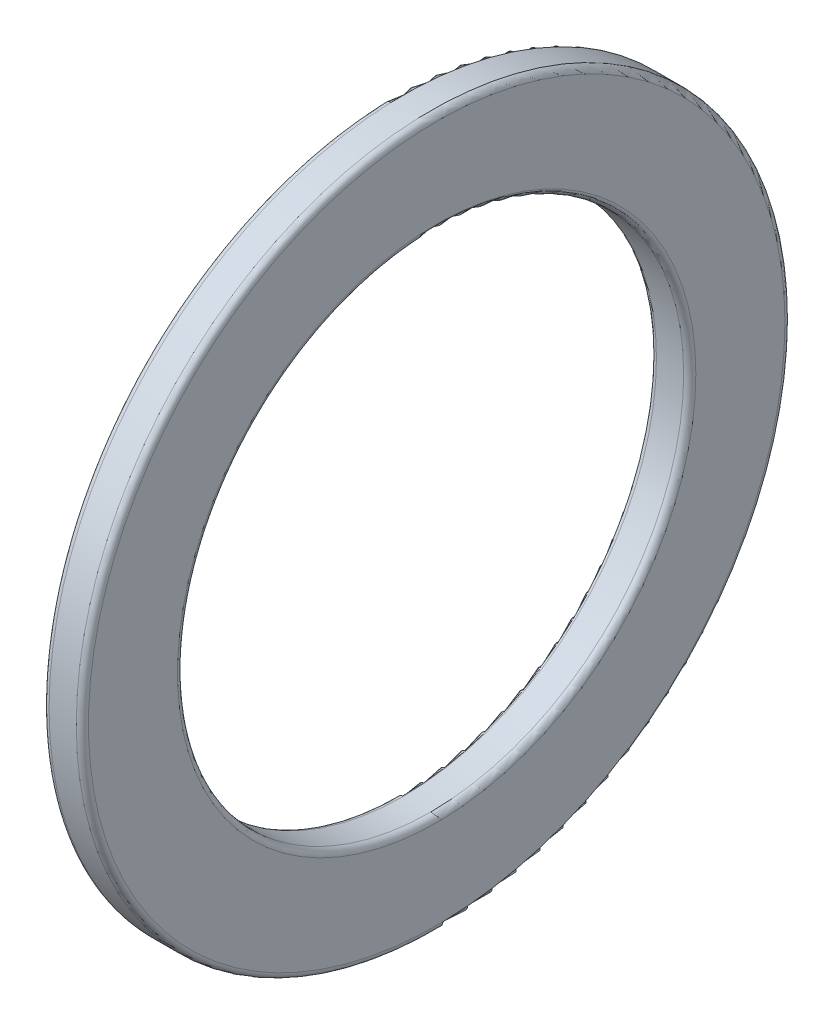
ISO-10303-21;
HEADER;
FILE_DESCRIPTION(('STEP AP214'),'2;1');
FILE_NAME('part.step','',(''),(''),'','','');
FILE_SCHEMA(('AUTOMOTIVE_DESIGN { 1 0 10303 214 1 1 1 1 }'));
ENDSEC;
DATA;
#1=APPLICATION_CONTEXT('core data for automotive mechanical design processes');
#2=APPLICATION_PROTOCOL_DEFINITION('international standard','automotive_design',2000,#1);
#3=PRODUCT_CONTEXT('',#1,'mechanical');
#4=PRODUCT('Part','Part','',(#3));
#5=PRODUCT_RELATED_PRODUCT_CATEGORY('part','',(#4));
#6=PRODUCT_DEFINITION_FORMATION('','',#4);
#7=PRODUCT_DEFINITION_CONTEXT('part definition',#1,'design');
#8=PRODUCT_DEFINITION('design','',#6,#7);
#9=PRODUCT_DEFINITION_SHAPE('','',#8);
#10=(LENGTH_UNIT() NAMED_UNIT(*) SI_UNIT(.MILLI.,.METRE.));
#11=(NAMED_UNIT(*) PLANE_ANGLE_UNIT() SI_UNIT($,.RADIAN.));
#12=(NAMED_UNIT(*) SI_UNIT($,.STERADIAN.) SOLID_ANGLE_UNIT());
#13=UNCERTAINTY_MEASURE_WITH_UNIT(LENGTH_MEASURE(1.E-05),#10,'distance_accuracy_value','');
#14=(GEOMETRIC_REPRESENTATION_CONTEXT(3) GLOBAL_UNCERTAINTY_ASSIGNED_CONTEXT((#13)) GLOBAL_UNIT_ASSIGNED_CONTEXT((#10,
#11,#12)) REPRESENTATION_CONTEXT('',''));
#15=CARTESIAN_POINT('',(0.,0.,0.));
#16=DIRECTION('',(0.,0.,1.));
#17=DIRECTION('',(1.,0.,0.));
#18=AXIS2_PLACEMENT_3D('',#15,#16,#17);
#19=CARTESIAN_POINT('',(0.,34.4,0.));
#20=DIRECTION('',(-1.,0.,0.));
#21=DIRECTION('',(0.,0.,1.));
#22=AXIS2_PLACEMENT_3D('',#19,#20,#21);
#23=PLANE('',#22);
#24=CARTESIAN_POINT('',(0.,0.,0.));
#25=DIRECTION('',(1.,0.,0.));
#26=DIRECTION('',(0.,0.,-1.));
#27=AXIS2_PLACEMENT_3D('',#24,#25,#26);
#28=CIRCLE('',#27,32.103429965518);
#29=CARTESIAN_POINT('',(0.,0.,-32.103429965518));
#30=VERTEX_POINT('',#29);
#31=EDGE_CURVE('E56',#30,#30,#28,.T.);
#32=ORIENTED_EDGE('',*,*,#31,.T.);
#33=EDGE_LOOP('',(#32));
#34=FACE_BOUND('',#33,.T.);
#35=CARTESIAN_POINT('',(0.,0.,0.));
#36=DIRECTION('',(1.,0.,0.));
#37=DIRECTION('',(0.,0.,-1.));
#38=AXIS2_PLACEMENT_3D('',#35,#36,#37);
#39=CIRCLE('',#38,34.4);
#40=CARTESIAN_POINT('',(0.,0.,-34.4));
#41=VERTEX_POINT('',#40);
#42=EDGE_CURVE('E54',#41,#41,#39,.T.);
#43=ORIENTED_EDGE('',*,*,#42,.F.);
#44=EDGE_LOOP('',(#43));
#45=FACE_BOUND('',#44,.T.);
#46=ADVANCED_FACE('F14',(#34,#45),#23,.T.);
#47=CARTESIAN_POINT('',(-3.1111111111112,0.,0.));
#48=DIRECTION('',(1.,0.,0.));
#49=DIRECTION('',(0.,0.,-1.));
#50=AXIS2_PLACEMENT_3D('',#47,#48,#49);
#51=TOROIDAL_SURFACE('',#50,30.5,3.50000000000009);
#52=ORIENTED_EDGE('',*,*,#31,.F.);
#53=EDGE_LOOP('',(#52));
#54=FACE_BOUND('',#53,.T.);
#55=CARTESIAN_POINT('',(0.,0.,0.));
#56=DIRECTION('',(1.,0.,0.));
#57=DIRECTION('',(0.,0.,-1.));
#58=AXIS2_PLACEMENT_3D('',#55,#56,#57);
#59=CIRCLE('',#58,28.896570034482);
#60=CARTESIAN_POINT('',(0.,0.,-28.896570034482));
#61=VERTEX_POINT('',#60);
#62=EDGE_CURVE('E51',#61,#61,#59,.T.);
#63=ORIENTED_EDGE('',*,*,#62,.T.);
#64=EDGE_LOOP('',(#63));
#65=FACE_BOUND('',#64,.T.);
#66=ADVANCED_FACE('F68',(#54,#65),#51,.F.);
#67=CARTESIAN_POINT('',(0.,28.896570034482,0.));
#68=DIRECTION('',(-1.,0.,0.));
#69=DIRECTION('',(0.,0.,1.));
#70=AXIS2_PLACEMENT_3D('',#67,#68,#69);
#71=PLANE('',#70);
#72=CARTESIAN_POINT('',(0.,0.,0.));
#73=DIRECTION('',(1.,0.,0.));
#74=DIRECTION('',(0.,0.,-1.));
#75=AXIS2_PLACEMENT_3D('',#72,#73,#74);
#76=CIRCLE('',#75,25.6);
#77=CARTESIAN_POINT('',(0.,0.,-25.6));
#78=VERTEX_POINT('',#77);
#79=EDGE_CURVE('E50',#78,#78,#76,.T.);
#80=ORIENTED_EDGE('',*,*,#79,.T.);
#81=EDGE_LOOP('',(#80));
#82=FACE_BOUND('',#81,.T.);
#83=ORIENTED_EDGE('',*,*,#62,.F.);
#84=EDGE_LOOP('',(#83));
#85=FACE_BOUND('',#84,.T.);
#86=ADVANCED_FACE('F70',(#82,#85),#71,.T.);
#87=CARTESIAN_POINT('',(0.599999999999872,0.,0.));
#88=DIRECTION('',(1.,0.,0.));
#89=DIRECTION('',(0.,0.,-1.));
#90=AXIS2_PLACEMENT_3D('',#87,#88,#89);
#91=TOROIDAL_SURFACE('',#90,25.6,0.599999999999872);
#92=CARTESIAN_POINT('',(0.6,0.,0.));
#93=DIRECTION('',(1.,0.,0.));
#94=DIRECTION('',(0.,0.,-1.));
#95=AXIS2_PLACEMENT_3D('',#92,#93,#94);
#96=CIRCLE('',#95,25.);
#97=CARTESIAN_POINT('',(0.6,0.,-25.));
#98=VERTEX_POINT('',#97);
#99=EDGE_CURVE('E43',#98,#98,#96,.T.);
#100=ORIENTED_EDGE('',*,*,#99,.T.);
#101=EDGE_LOOP('',(#100));
#102=FACE_BOUND('',#101,.T.);
#103=ORIENTED_EDGE('',*,*,#79,.F.);
#104=EDGE_LOOP('',(#103));
#105=FACE_BOUND('',#104,.T.);
#106=ADVANCED_FACE('F72',(#102,#105),#91,.T.);
#107=CARTESIAN_POINT('',(3.8888888888889,0.,0.));
#108=DIRECTION('',(1.,0.,0.));
#109=DIRECTION('',(0.,0.,-1.));
#110=AXIS2_PLACEMENT_3D('',#107,#108,#109);
#111=CYLINDRICAL_SURFACE('',#110,25.);
#112=CARTESIAN_POINT('',(3.2888888888889,0.,0.));
#113=DIRECTION('',(1.,0.,0.));
#114=DIRECTION('',(0.,0.,-1.));
#115=AXIS2_PLACEMENT_3D('',#112,#113,#114);
#116=CIRCLE('',#115,25.);
#117=CARTESIAN_POINT('',(3.2888888888889,0.,-25.));
#118=VERTEX_POINT('',#117);
#119=EDGE_CURVE('E39',#118,#118,#116,.T.);
#120=ORIENTED_EDGE('',*,*,#119,.T.);
#121=EDGE_LOOP('',(#120));
#122=FACE_BOUND('',#121,.T.);
#123=ORIENTED_EDGE('',*,*,#99,.F.);
#124=EDGE_LOOP('',(#123));
#125=FACE_BOUND('',#124,.T.);
#126=ADVANCED_FACE('F82',(#122,#125),#111,.F.);
#127=CARTESIAN_POINT('',(3.28888888888898,0.,0.));
#128=DIRECTION('',(1.,0.,0.));
#129=DIRECTION('',(0.,0.,-1.));
#130=AXIS2_PLACEMENT_3D('',#127,#128,#129);
#131=TOROIDAL_SURFACE('',#130,25.6,0.59999999999992);
#132=CARTESIAN_POINT('',(3.8888888888889,0.,0.));
#133=DIRECTION('',(1.,0.,0.));
#134=DIRECTION('',(0.,0.,-1.));
#135=AXIS2_PLACEMENT_3D('',#132,#133,#134);
#136=CIRCLE('',#135,25.599999980008);
#137=CARTESIAN_POINT('',(3.8888888888889,0.,-25.599999980008));
#138=VERTEX_POINT('',#137);
#139=EDGE_CURVE('E31',#138,#138,#136,.T.);
#140=ORIENTED_EDGE('',*,*,#139,.T.);
#141=EDGE_LOOP('',(#140));
#142=FACE_BOUND('',#141,.T.);
#143=ORIENTED_EDGE('',*,*,#119,.F.);
#144=EDGE_LOOP('',(#143));
#145=FACE_BOUND('',#144,.T.);
#146=ADVANCED_FACE('F117',(#142,#145),#131,.T.);
#147=CARTESIAN_POINT('',(3.8888888888889,25.6,0.));
#148=DIRECTION('',(1.,0.,0.));
#149=DIRECTION('',(0.,0.,-1.));
#150=AXIS2_PLACEMENT_3D('',#147,#148,#149);
#151=PLANE('',#150);
#152=CARTESIAN_POINT('',(3.8888888888889,0.,0.));
#153=DIRECTION('',(1.,0.,0.));
#154=DIRECTION('',(0.,0.,-1.));
#155=AXIS2_PLACEMENT_3D('',#152,#153,#154);
#156=CIRCLE('',#155,34.4);
#157=CARTESIAN_POINT('',(3.8888888888889,0.,-34.4));
#158=VERTEX_POINT('',#157);
#159=EDGE_CURVE('E29',#158,#158,#156,.T.);
#160=ORIENTED_EDGE('',*,*,#159,.T.);
#161=EDGE_LOOP('',(#160));
#162=FACE_BOUND('',#161,.T.);
#163=ORIENTED_EDGE('',*,*,#139,.F.);
#164=EDGE_LOOP('',(#163));
#165=FACE_BOUND('',#164,.T.);
#166=ADVANCED_FACE('F126',(#162,#165),#151,.T.);
#167=CARTESIAN_POINT('',(3.28888888888895,0.,0.));
#168=DIRECTION('',(1.,0.,0.));
#169=DIRECTION('',(0.,0.,-1.));
#170=AXIS2_PLACEMENT_3D('',#167,#168,#169);
#171=TOROIDAL_SURFACE('',#170,34.4,0.599999999999945);
#172=CARTESIAN_POINT('',(3.2888888888889,0.,0.));
#173=DIRECTION('',(1.,0.,0.));
#174=DIRECTION('',(0.,0.,-1.));
#175=AXIS2_PLACEMENT_3D('',#172,#173,#174);
#176=CIRCLE('',#175,35.);
#177=CARTESIAN_POINT('',(3.2888888888889,0.,-35.));
#178=VERTEX_POINT('',#177);
#179=EDGE_CURVE('E22',#178,#178,#176,.T.);
#180=ORIENTED_EDGE('',*,*,#179,.T.);
#181=EDGE_LOOP('',(#180));
#182=FACE_BOUND('',#181,.T.);
#183=ORIENTED_EDGE('',*,*,#159,.F.);
#184=EDGE_LOOP('',(#183));
#185=FACE_BOUND('',#184,.T.);
#186=ADVANCED_FACE('F140',(#182,#185),#171,.T.);
#187=CARTESIAN_POINT('',(3.8888888888889,0.,0.));
#188=DIRECTION('',(1.,0.,0.));
#189=DIRECTION('',(0.,0.,-1.));
#190=AXIS2_PLACEMENT_3D('',#187,#188,#189);
#191=CYLINDRICAL_SURFACE('',#190,35.);
#192=CARTESIAN_POINT('',(0.6,0.,0.));
#193=DIRECTION('',(1.,0.,0.));
#194=DIRECTION('',(0.,0.,-1.));
#195=AXIS2_PLACEMENT_3D('',#192,#193,#194);
#196=CIRCLE('',#195,35.);
#197=CARTESIAN_POINT('',(0.6,0.,-35.));
#198=VERTEX_POINT('',#197);
#199=EDGE_CURVE('E9',#198,#198,#196,.T.);
#200=ORIENTED_EDGE('',*,*,#199,.T.);
#201=EDGE_LOOP('',(#200));
#202=FACE_BOUND('',#201,.T.);
#203=ORIENTED_EDGE('',*,*,#179,.F.);
#204=EDGE_LOOP('',(#203));
#205=FACE_BOUND('',#204,.T.);
#206=ADVANCED_FACE('F150',(#202,#205),#191,.T.);
#207=CARTESIAN_POINT('',(0.599999999999892,0.,0.));
#208=DIRECTION('',(1.,0.,0.));
#209=DIRECTION('',(0.,0.,-1.));
#210=AXIS2_PLACEMENT_3D('',#207,#208,#209);
#211=TOROIDAL_SURFACE('',#210,34.4,0.599999999999892);
#212=ORIENTED_EDGE('',*,*,#42,.T.);
#213=EDGE_LOOP('',(#212));
#214=FACE_BOUND('',#213,.T.);
#215=ORIENTED_EDGE('',*,*,#199,.F.);
#216=EDGE_LOOP('',(#215));
#217=FACE_BOUND('',#216,.T.);
#218=ADVANCED_FACE('F16',(#214,#217),#211,.T.);
#219=CLOSED_SHELL('',(#46,#66,#86,#106,#126,#146,#166,#186,#206,#218));
#220=MANIFOLD_SOLID_BREP('B1',#219);
#221=ADVANCED_BREP_SHAPE_REPRESENTATION('',(#18,#220),#14);
#222=SHAPE_DEFINITION_REPRESENTATION(#9,#221);
ENDSEC;
END-ISO-10303-21;
